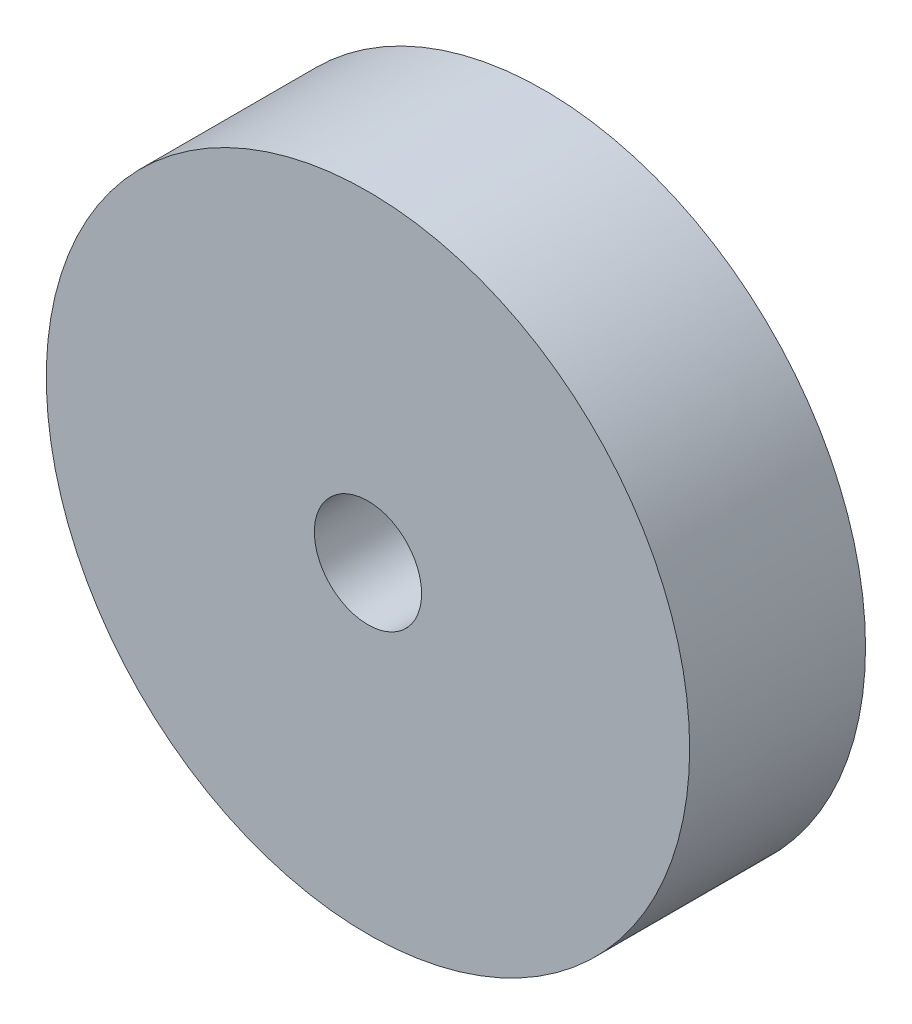
ISO-10303-21;
HEADER;
FILE_DESCRIPTION(('STEP AP214'),'2;1');
FILE_NAME('part.step','',(''),(''),'','','');
FILE_SCHEMA(('AUTOMOTIVE_DESIGN { 1 0 10303 214 1 1 1 1 }'));
ENDSEC;
DATA;
#1=APPLICATION_CONTEXT('core data for automotive mechanical design processes');
#2=APPLICATION_PROTOCOL_DEFINITION('international standard','automotive_design',2000,#1);
#3=PRODUCT_CONTEXT('',#1,'mechanical');
#4=PRODUCT('Part','Part','',(#3));
#5=PRODUCT_RELATED_PRODUCT_CATEGORY('part','',(#4));
#6=PRODUCT_DEFINITION_FORMATION('','',#4);
#7=PRODUCT_DEFINITION_CONTEXT('part definition',#1,'design');
#8=PRODUCT_DEFINITION('design','',#6,#7);
#9=PRODUCT_DEFINITION_SHAPE('','',#8);
#10=(LENGTH_UNIT() NAMED_UNIT(*) SI_UNIT(.MILLI.,.METRE.));
#11=(NAMED_UNIT(*) PLANE_ANGLE_UNIT() SI_UNIT($,.RADIAN.));
#12=(NAMED_UNIT(*) SI_UNIT($,.STERADIAN.) SOLID_ANGLE_UNIT());
#13=UNCERTAINTY_MEASURE_WITH_UNIT(LENGTH_MEASURE(1.E-05),#10,'distance_accuracy_value','');
#14=(GEOMETRIC_REPRESENTATION_CONTEXT(3) GLOBAL_UNCERTAINTY_ASSIGNED_CONTEXT((#13)) GLOBAL_UNIT_ASSIGNED_CONTEXT((#10,
#11,#12)) REPRESENTATION_CONTEXT('',''));
#15=CARTESIAN_POINT('',(0.,0.,0.));
#16=DIRECTION('',(0.,0.,1.));
#17=DIRECTION('',(1.,0.,0.));
#18=AXIS2_PLACEMENT_3D('',#15,#16,#17);
#19=CARTESIAN_POINT('',(-13.9028833057808,4.64519847288133,4.1));
#20=DIRECTION('',(0.,0.,1.));
#21=DIRECTION('',(1.,0.,0.));
#22=AXIS2_PLACEMENT_3D('',#19,#20,#21);
#23=PLANE('',#22);
#24=CARTESIAN_POINT('',(-13.9028833057808,4.64519847288133,4.1));
#25=DIRECTION('',(0.,0.,1.));
#26=DIRECTION('',(1.,0.,0.));
#27=AXIS2_PLACEMENT_3D('',#24,#25,#26);
#28=CIRCLE('',#27,7.5);
#29=CARTESIAN_POINT('',(-6.40288330578081,4.64519847288133,4.1));
#30=VERTEX_POINT('',#29);
#31=EDGE_CURVE('E10',#30,#30,#28,.T.);
#32=ORIENTED_EDGE('',*,*,#31,.T.);
#33=EDGE_LOOP('',(#32));
#34=FACE_BOUND('',#33,.T.);
#35=CARTESIAN_POINT('',(-13.9028833057808,4.64519847288133,4.1));
#36=DIRECTION('',(0.,0.,1.));
#37=DIRECTION('',(1.,0.,0.));
#38=AXIS2_PLACEMENT_3D('',#35,#36,#37);
#39=CIRCLE('',#38,1.25);
#40=CARTESIAN_POINT('',(-12.6528833057808,4.64519847288133,4.1));
#41=VERTEX_POINT('',#40);
#42=EDGE_CURVE('E41',#41,#41,#39,.T.);
#43=ORIENTED_EDGE('',*,*,#42,.F.);
#44=EDGE_LOOP('',(#43));
#45=FACE_BOUND('',#44,.T.);
#46=ADVANCED_FACE('F30',(#34,#45),#23,.T.);
#47=CARTESIAN_POINT('',(-13.9028833057808,4.64519847288133,0.));
#48=DIRECTION('',(0.,0.,1.));
#49=DIRECTION('',(1.,0.,0.));
#50=AXIS2_PLACEMENT_3D('',#47,#48,#49);
#51=PLANE('',#50);
#52=CARTESIAN_POINT('',(-13.9028833057808,4.64519847288133,0.));
#53=DIRECTION('',(0.,0.,1.));
#54=DIRECTION('',(1.,0.,0.));
#55=AXIS2_PLACEMENT_3D('',#52,#53,#54);
#56=CIRCLE('',#55,7.5);
#57=CARTESIAN_POINT('',(-6.40288330578081,4.64519847288133,0.));
#58=VERTEX_POINT('',#57);
#59=EDGE_CURVE('E34',#58,#58,#56,.T.);
#60=ORIENTED_EDGE('',*,*,#59,.F.);
#61=EDGE_LOOP('',(#60));
#62=FACE_BOUND('',#61,.T.);
#63=CARTESIAN_POINT('',(-13.9028833057808,4.64519847288133,0.));
#64=DIRECTION('',(0.,0.,1.));
#65=DIRECTION('',(1.,0.,0.));
#66=AXIS2_PLACEMENT_3D('',#63,#64,#65);
#67=CIRCLE('',#66,1.25);
#68=CARTESIAN_POINT('',(-12.6528833057808,4.64519847288133,0.));
#69=VERTEX_POINT('',#68);
#70=EDGE_CURVE('E43',#69,#69,#67,.T.);
#71=ORIENTED_EDGE('',*,*,#70,.T.);
#72=EDGE_LOOP('',(#71));
#73=FACE_BOUND('',#72,.T.);
#74=ADVANCED_FACE('F53',(#62,#73),#51,.F.);
#75=CARTESIAN_POINT('',(-13.9028833057808,4.64519847288133,4.1));
#76=DIRECTION('',(0.,0.,-1.));
#77=DIRECTION('',(-1.,0.,0.));
#78=AXIS2_PLACEMENT_3D('',#75,#76,#77);
#79=CYLINDRICAL_SURFACE('',#78,7.5);
#80=ORIENTED_EDGE('',*,*,#31,.F.);
#81=EDGE_LOOP('',(#80));
#82=FACE_BOUND('',#81,.T.);
#83=ORIENTED_EDGE('',*,*,#59,.T.);
#84=EDGE_LOOP('',(#83));
#85=FACE_BOUND('',#84,.T.);
#86=ADVANCED_FACE('F32',(#82,#85),#79,.T.);
#87=CARTESIAN_POINT('',(-13.9028833057808,4.64519847288133,4.1));
#88=DIRECTION('',(0.,0.,-1.));
#89=DIRECTION('',(-1.,0.,0.));
#90=AXIS2_PLACEMENT_3D('',#87,#88,#89);
#91=CYLINDRICAL_SURFACE('',#90,1.25);
#92=ORIENTED_EDGE('',*,*,#42,.T.);
#93=EDGE_LOOP('',(#92));
#94=FACE_BOUND('',#93,.T.);
#95=ORIENTED_EDGE('',*,*,#70,.F.);
#96=EDGE_LOOP('',(#95));
#97=FACE_BOUND('',#96,.T.);
#98=ADVANCED_FACE('F49',(#94,#97),#91,.F.);
#99=CLOSED_SHELL('',(#46,#74,#86,#98));
#100=MANIFOLD_SOLID_BREP('B2',#99);
#101=ADVANCED_BREP_SHAPE_REPRESENTATION('',(#18,#100),#14);
#102=SHAPE_DEFINITION_REPRESENTATION(#9,#101);
ENDSEC;
END-ISO-10303-21;
